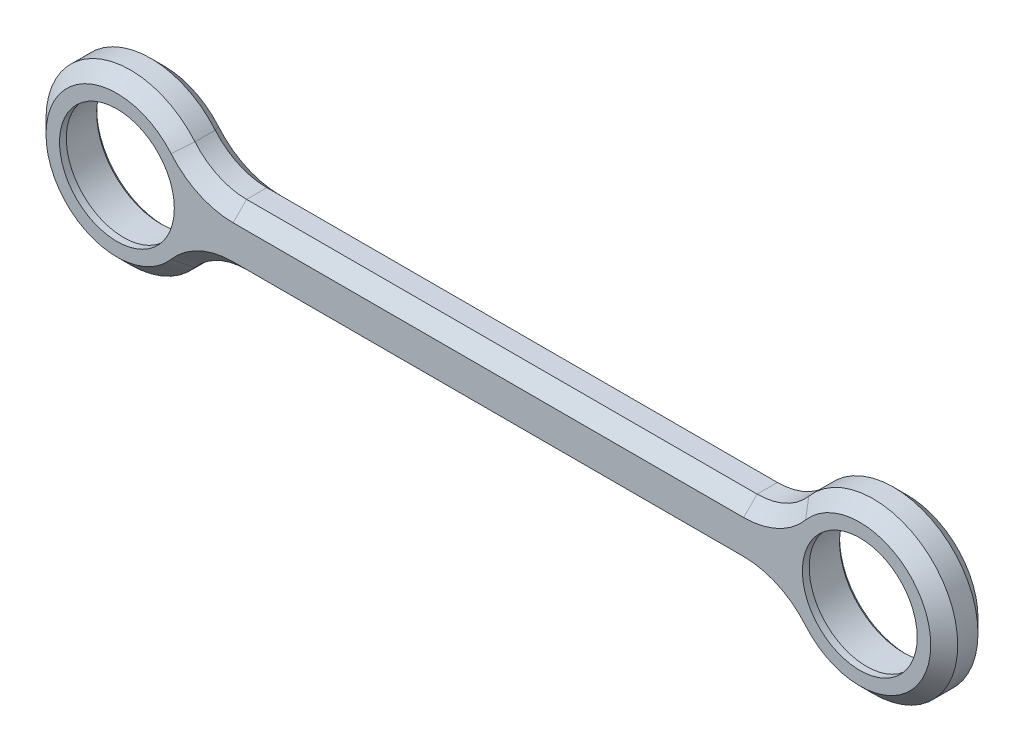
ISO-10303-21;
HEADER;
FILE_DESCRIPTION(('STEP AP214'),'2;1');
FILE_NAME('part.step','',(''),(''),'','','');
FILE_SCHEMA(('AUTOMOTIVE_DESIGN { 1 0 10303 214 1 1 1 1 }'));
ENDSEC;
DATA;
#1=APPLICATION_CONTEXT('core data for automotive mechanical design processes');
#2=APPLICATION_PROTOCOL_DEFINITION('international standard','automotive_design',2000,#1);
#3=PRODUCT_CONTEXT('',#1,'mechanical');
#4=PRODUCT('Part','Part','',(#3));
#5=PRODUCT_RELATED_PRODUCT_CATEGORY('part','',(#4));
#6=PRODUCT_DEFINITION_FORMATION('','',#4);
#7=PRODUCT_DEFINITION_CONTEXT('part definition',#1,'design');
#8=PRODUCT_DEFINITION('design','',#6,#7);
#9=PRODUCT_DEFINITION_SHAPE('','',#8);
#10=(LENGTH_UNIT() NAMED_UNIT(*) SI_UNIT(.MILLI.,.METRE.));
#11=(NAMED_UNIT(*) PLANE_ANGLE_UNIT() SI_UNIT($,.RADIAN.));
#12=(NAMED_UNIT(*) SI_UNIT($,.STERADIAN.) SOLID_ANGLE_UNIT());
#13=UNCERTAINTY_MEASURE_WITH_UNIT(LENGTH_MEASURE(1.E-05),#10,'distance_accuracy_value','');
#14=(GEOMETRIC_REPRESENTATION_CONTEXT(3) GLOBAL_UNCERTAINTY_ASSIGNED_CONTEXT((#13)) GLOBAL_UNIT_ASSIGNED_CONTEXT((#10,
#11,#12)) REPRESENTATION_CONTEXT('',''));
#15=CARTESIAN_POINT('',(0.,0.,0.));
#16=DIRECTION('',(0.,0.,1.));
#17=DIRECTION('',(1.,0.,0.));
#18=AXIS2_PLACEMENT_3D('',#15,#16,#17);
#19=CARTESIAN_POINT('',(9.19809234408251,-24.5,-145.795302177454));
#20=DIRECTION('',(0.,1.,0.));
#21=DIRECTION('',(0.,0.,1.));
#22=AXIS2_PLACEMENT_3D('',#19,#20,#21);
#23=PLANE('',#22);
#24=DIRECTION('',(0.,0.,-1.));
#25=VECTOR('',#24,1.);
#26=CARTESIAN_POINT('',(-92.795349465914,-24.5,-8.49999999999557));
#27=LINE('',#26,#25);
#28=CARTESIAN_POINT('',(-92.795349465914,-24.5,-3.49999999999559));
#29=VERTEX_POINT('',#28);
#30=CARTESIAN_POINT('',(-92.795349465914,-24.5,-6.49999999999554));
#31=VERTEX_POINT('',#30);
#32=EDGE_CURVE('E191',#29,#31,#27,.T.);
#33=ORIENTED_EDGE('',*,*,#32,.T.);
#34=DIRECTION('',(1.,0.,0.));
#35=VECTOR('',#34,1.);
#36=CARTESIAN_POINT('',(9.19809234408251,-24.5,-6.49999999999554));
#37=LINE('',#36,#35);
#38=CARTESIAN_POINT('',(-17.2046505340859,-24.5,-6.49999999999554));
#39=VERTEX_POINT('',#38);
#40=EDGE_CURVE('E163',#31,#39,#37,.T.);
#41=ORIENTED_EDGE('',*,*,#40,.T.);
#42=DIRECTION('',(0.,0.,-1.));
#43=VECTOR('',#42,1.);
#44=CARTESIAN_POINT('',(-17.2046505340859,-24.5,-1.49999999999556));
#45=LINE('',#44,#43);
#46=CARTESIAN_POINT('',(-17.2046505340859,-24.5,-3.49999999999559));
#47=VERTEX_POINT('',#46);
#48=EDGE_CURVE('E189',#39,#47,#45,.F.);
#49=ORIENTED_EDGE('',*,*,#48,.T.);
#50=DIRECTION('',(-1.,0.,0.));
#51=VECTOR('',#50,1.);
#52=CARTESIAN_POINT('',(-92.795349465914,-24.5,-3.49999999999559));
#53=LINE('',#52,#51);
#54=EDGE_CURVE('E195',#47,#29,#53,.T.);
#55=ORIENTED_EDGE('',*,*,#54,.T.);
#56=EDGE_LOOP('',(#33,#41,#49,#55));
#57=FACE_BOUND('',#56,.T.);
#58=ADVANCED_FACE('F40',(#57),#23,.F.);
#59=CARTESIAN_POINT('',(-109.999999999999,-20.,-145.795302177454));
#60=DIRECTION('',(0.,0.,1.));
#61=DIRECTION('',(1.,0.,0.));
#62=AXIS2_PLACEMENT_3D('',#59,#60,#61);
#63=CYLINDRICAL_SURFACE('',#62,12.5);
#64=DIRECTION('',(0.,0.,1.));
#65=VECTOR('',#64,1.);
#66=CARTESIAN_POINT('',(-100.441860814396,-11.9444444444444,-145.795302177454));
#67=LINE('',#66,#65);
#68=CARTESIAN_POINT('',(-100.441860814396,-11.9444444444444,-3.49999999999559));
#69=VERTEX_POINT('',#68);
#70=CARTESIAN_POINT('',(-100.441860814396,-11.9444444444444,-6.49999999999554));
#71=VERTEX_POINT('',#70);
#72=EDGE_CURVE('E200',#69,#71,#67,.F.);
#73=ORIENTED_EDGE('',*,*,#72,.T.);
#74=CARTESIAN_POINT('',(-109.999999999999,-20.,-6.49999999999554));
#75=DIRECTION('',(0.,0.,1.));
#76=DIRECTION('',(1.,0.,0.));
#77=AXIS2_PLACEMENT_3D('',#74,#75,#76);
#78=CIRCLE('',#77,12.5);
#79=CARTESIAN_POINT('',(-100.441860814396,-28.0555555555556,-6.49999999999554));
#80=VERTEX_POINT('',#79);
#81=EDGE_CURVE('E255',#71,#80,#78,.T.);
#82=ORIENTED_EDGE('',*,*,#81,.T.);
#83=DIRECTION('',(0.,0.,1.));
#84=VECTOR('',#83,1.);
#85=CARTESIAN_POINT('',(-100.441860814396,-28.0555555555556,-145.795302177454));
#86=LINE('',#85,#84);
#87=CARTESIAN_POINT('',(-100.441860814396,-28.0555555555556,-3.49999999999559));
#88=VERTEX_POINT('',#87);
#89=EDGE_CURVE('E206',#80,#88,#86,.T.);
#90=ORIENTED_EDGE('',*,*,#89,.T.);
#91=CARTESIAN_POINT('',(-109.999999999999,-20.,-3.49999999999559));
#92=DIRECTION('',(0.,0.,1.));
#93=DIRECTION('',(1.,0.,0.));
#94=AXIS2_PLACEMENT_3D('',#91,#92,#93);
#95=CIRCLE('',#94,12.5);
#96=EDGE_CURVE('E252',#88,#69,#95,.F.);
#97=ORIENTED_EDGE('',*,*,#96,.T.);
#98=EDGE_LOOP('',(#73,#82,#90,#97));
#99=FACE_BOUND('',#98,.T.);
#100=ADVANCED_FACE('F467',(#99),#63,.T.);
#101=CARTESIAN_POINT('',(9.19809234408251,-15.5,-145.795302177454));
#102=DIRECTION('',(0.,-1.,0.));
#103=DIRECTION('',(0.,0.,-1.));
#104=AXIS2_PLACEMENT_3D('',#101,#102,#103);
#105=PLANE('',#104);
#106=DIRECTION('',(0.,0.,-1.));
#107=VECTOR('',#106,1.);
#108=CARTESIAN_POINT('',(-17.2046505340859,-15.5,-8.49999999999557));
#109=LINE('',#108,#107);
#110=CARTESIAN_POINT('',(-17.2046505340859,-15.5,-3.49999999999559));
#111=VERTEX_POINT('',#110);
#112=CARTESIAN_POINT('',(-17.2046505340859,-15.5,-6.49999999999554));
#113=VERTEX_POINT('',#112);
#114=EDGE_CURVE('E209',#111,#113,#109,.T.);
#115=ORIENTED_EDGE('',*,*,#114,.T.);
#116=DIRECTION('',(-1.,0.,0.));
#117=VECTOR('',#116,1.);
#118=CARTESIAN_POINT('',(9.19809234408251,-15.5,-6.49999999999554));
#119=LINE('',#118,#117);
#120=CARTESIAN_POINT('',(-92.7953494659139,-15.5,-6.49999999999554));
#121=VERTEX_POINT('',#120);
#122=EDGE_CURVE('E273',#113,#121,#119,.T.);
#123=ORIENTED_EDGE('',*,*,#122,.T.);
#124=DIRECTION('',(0.,0.,-1.));
#125=VECTOR('',#124,1.);
#126=CARTESIAN_POINT('',(-92.7953494659139,-15.5,-1.49999999999556));
#127=LINE('',#126,#125);
#128=CARTESIAN_POINT('',(-92.7953494659139,-15.5,-3.49999999999559));
#129=VERTEX_POINT('',#128);
#130=EDGE_CURVE('E399',#121,#129,#127,.F.);
#131=ORIENTED_EDGE('',*,*,#130,.T.);
#132=DIRECTION('',(1.,0.,0.));
#133=VECTOR('',#132,1.);
#134=CARTESIAN_POINT('',(-17.2046505340859,-15.5,-3.49999999999559));
#135=LINE('',#134,#133);
#136=EDGE_CURVE('E270',#129,#111,#135,.T.);
#137=ORIENTED_EDGE('',*,*,#136,.T.);
#138=EDGE_LOOP('',(#115,#123,#131,#137));
#139=FACE_BOUND('',#138,.T.);
#140=ADVANCED_FACE('F413',(#139),#105,.F.);
#141=CARTESIAN_POINT('',(-6.09765588539139E-13,-20.,-145.795302177454));
#142=DIRECTION('',(0.,0.,1.));
#143=DIRECTION('',(1.,0.,0.));
#144=AXIS2_PLACEMENT_3D('',#141,#142,#143);
#145=CYLINDRICAL_SURFACE('',#144,12.5);
#146=DIRECTION('',(0.,0.,1.));
#147=VECTOR('',#146,1.);
#148=CARTESIAN_POINT('',(-9.55813918560353,-28.0555555555556,-145.795302177454));
#149=LINE('',#148,#147);
#150=CARTESIAN_POINT('',(-9.55813918560353,-28.0555555555556,-3.49999999999559));
#151=VERTEX_POINT('',#150);
#152=CARTESIAN_POINT('',(-9.55813918560353,-28.0555555555556,-6.49999999999554));
#153=VERTEX_POINT('',#152);
#154=EDGE_CURVE('E391',#151,#153,#149,.F.);
#155=ORIENTED_EDGE('',*,*,#154,.T.);
#156=CARTESIAN_POINT('',(-6.09765588539139E-13,-20.,-6.49999999999554));
#157=DIRECTION('',(0.,0.,1.));
#158=DIRECTION('',(1.,0.,0.));
#159=AXIS2_PLACEMENT_3D('',#156,#157,#158);
#160=CIRCLE('',#159,12.5);
#161=CARTESIAN_POINT('',(-9.55813918560353,-11.9444444444445,-6.49999999999554));
#162=VERTEX_POINT('',#161);
#163=EDGE_CURVE('E249',#153,#162,#160,.T.);
#164=ORIENTED_EDGE('',*,*,#163,.T.);
#165=DIRECTION('',(0.,0.,1.));
#166=VECTOR('',#165,1.);
#167=CARTESIAN_POINT('',(-9.55813918560353,-11.9444444444445,-145.795302177454));
#168=LINE('',#167,#166);
#169=CARTESIAN_POINT('',(-9.55813918560353,-11.9444444444445,-3.49999999999559));
#170=VERTEX_POINT('',#169);
#171=EDGE_CURVE('E389',#162,#170,#168,.T.);
#172=ORIENTED_EDGE('',*,*,#171,.T.);
#173=CARTESIAN_POINT('',(-6.09765588539139E-13,-20.,-3.49999999999559));
#174=DIRECTION('',(0.,0.,1.));
#175=DIRECTION('',(1.,0.,0.));
#176=AXIS2_PLACEMENT_3D('',#173,#174,#175);
#177=CIRCLE('',#176,12.5);
#178=EDGE_CURVE('E246',#170,#151,#177,.F.);
#179=ORIENTED_EDGE('',*,*,#178,.T.);
#180=EDGE_LOOP('',(#155,#164,#172,#179));
#181=FACE_BOUND('',#180,.T.);
#182=ADVANCED_FACE('F388',(#181),#145,.T.);
#183=CARTESIAN_POINT('',(-6.09765588539139E-13,-20.,-145.795302177454));
#184=DIRECTION('',(0.,0.,1.));
#185=DIRECTION('',(1.,0.,0.));
#186=AXIS2_PLACEMENT_3D('',#183,#184,#185);
#187=CYLINDRICAL_SURFACE('',#186,9.49999999999999);
#188=CARTESIAN_POINT('',(-6.09765588539139E-13,-20.,-7.99999999999557));
#189=DIRECTION('',(0.,0.,1.));
#190=DIRECTION('',(1.,0.,0.));
#191=AXIS2_PLACEMENT_3D('',#188,#189,#190);
#192=CIRCLE('',#191,9.49999999999999);
#193=CARTESIAN_POINT('',(9.49999999999938,-20.,-7.99999999999557));
#194=VERTEX_POINT('',#193);
#195=EDGE_CURVE('E50',#194,#194,#192,.F.);
#196=ORIENTED_EDGE('',*,*,#195,.T.);
#197=EDGE_LOOP('',(#196));
#198=FACE_BOUND('',#197,.T.);
#199=CARTESIAN_POINT('',(-6.09765588539139E-13,-20.,-2.49999999999556));
#200=DIRECTION('',(0.,0.,-1.));
#201=DIRECTION('',(0.,1.,0.));
#202=AXIS2_PLACEMENT_3D('',#199,#200,#201);
#203=CIRCLE('',#202,9.49999999999999);
#204=CARTESIAN_POINT('',(-6.09765588539139E-13,-10.5,-2.49999999999555));
#205=VERTEX_POINT('',#204);
#206=EDGE_CURVE('E429',#205,#205,#203,.T.);
#207=ORIENTED_EDGE('',*,*,#206,.F.);
#208=EDGE_LOOP('',(#207));
#209=FACE_BOUND('',#208,.T.);
#210=ADVANCED_FACE('F362',(#198,#209),#187,.F.);
#211=CARTESIAN_POINT('',(-109.999999999999,-20.,-145.795302177454));
#212=DIRECTION('',(0.,0.,1.));
#213=DIRECTION('',(1.,0.,0.));
#214=AXIS2_PLACEMENT_3D('',#211,#212,#213);
#215=CYLINDRICAL_SURFACE('',#214,9.49999999999953);
#216=CARTESIAN_POINT('',(-109.999999999999,-20.,-7.99999999999557));
#217=DIRECTION('',(0.,0.,1.));
#218=DIRECTION('',(1.,0.,0.));
#219=AXIS2_PLACEMENT_3D('',#216,#217,#218);
#220=CIRCLE('',#219,9.49999999999953);
#221=CARTESIAN_POINT('',(-100.5,-20.,-7.99999999999557));
#222=VERTEX_POINT('',#221);
#223=EDGE_CURVE('E11',#222,#222,#220,.F.);
#224=ORIENTED_EDGE('',*,*,#223,.T.);
#225=EDGE_LOOP('',(#224));
#226=FACE_BOUND('',#225,.T.);
#227=CARTESIAN_POINT('',(-109.999999999999,-20.,-2.49999999999556));
#228=DIRECTION('',(0.,0.,-1.));
#229=DIRECTION('',(0.,1.,0.));
#230=AXIS2_PLACEMENT_3D('',#227,#228,#229);
#231=CIRCLE('',#230,9.49999999999953);
#232=CARTESIAN_POINT('',(-109.999999999999,-10.5000000000004,-2.49999999999555));
#233=VERTEX_POINT('',#232);
#234=EDGE_CURVE('E425',#233,#233,#231,.T.);
#235=ORIENTED_EDGE('',*,*,#234,.F.);
#236=EDGE_LOOP('',(#235));
#237=FACE_BOUND('',#236,.T.);
#238=ADVANCED_FACE('F375',(#226,#237),#215,.F.);
#239=CARTESIAN_POINT('',(7.35354814963609,-20.1497737122483,-8.49999999999555));
#240=DIRECTION('',(0.,0.,1.));
#241=DIRECTION('',(0.999792646095991,-0.0203633202689731,0.));
#242=AXIS2_PLACEMENT_3D('',#239,#240,#241);
#243=PLANE('',#242);
#244=CARTESIAN_POINT('',(-6.09765588539139E-13,-20.,-8.49999999999555));
#245=DIRECTION('',(0.,0.,1.));
#246=DIRECTION('',(0.,-1.,0.));
#247=AXIS2_PLACEMENT_3D('',#244,#245,#246);
#248=CIRCLE('',#247,9.99999999999997);
#249=CARTESIAN_POINT('',(-6.09765588539139E-13,-30.,-8.49999999999556));
#250=VERTEX_POINT('',#249);
#251=EDGE_CURVE('E355',#250,#250,#248,.T.);
#252=ORIENTED_EDGE('',*,*,#251,.T.);
#253=EDGE_LOOP('',(#252));
#254=FACE_BOUND('',#253,.T.);
#255=CARTESIAN_POINT('',(-109.999999999999,-20.,-8.49999999999555));
#256=DIRECTION('',(0.,0.,1.));
#257=DIRECTION('',(0.,-1.,0.));
#258=AXIS2_PLACEMENT_3D('',#255,#256,#257);
#259=CIRCLE('',#258,9.9999999999995);
#260=CARTESIAN_POINT('',(-109.999999999999,-29.9999999999995,-8.49999999999556));
#261=VERTEX_POINT('',#260);
#262=EDGE_CURVE('E297',#261,#261,#259,.T.);
#263=ORIENTED_EDGE('',*,*,#262,.T.);
#264=EDGE_LOOP('',(#263));
#265=FACE_BOUND('',#264,.T.);
#266=CARTESIAN_POINT('',(-17.2046505340859,-34.5,-8.49999999999556));
#267=DIRECTION('',(0.,0.,1.));
#268=DIRECTION('',(0.,-1.,0.));
#269=AXIS2_PLACEMENT_3D('',#266,#267,#268);
#270=CIRCLE('',#269,12.);
#271=CARTESIAN_POINT('',(-8.02883691590706,-26.7666666666667,-8.49999999999556));
#272=VERTEX_POINT('',#271);
#273=CARTESIAN_POINT('',(-17.2046505340859,-22.5,-8.49999999999555));
#274=VERTEX_POINT('',#273);
#275=EDGE_CURVE('E234',#272,#274,#270,.T.);
#276=ORIENTED_EDGE('',*,*,#275,.T.);
#277=DIRECTION('',(-1.,0.,0.));
#278=VECTOR('',#277,1.);
#279=CARTESIAN_POINT('',(7.35354814963609,-22.5,-8.49999999999555));
#280=LINE('',#279,#278);
#281=CARTESIAN_POINT('',(-92.795349465914,-22.5,-8.49999999999555));
#282=VERTEX_POINT('',#281);
#283=EDGE_CURVE('E165',#274,#282,#280,.T.);
#284=ORIENTED_EDGE('',*,*,#283,.T.);
#285=CARTESIAN_POINT('',(-92.795349465914,-34.5,-8.49999999999556));
#286=DIRECTION('',(0.,0.,1.));
#287=DIRECTION('',(0.,-1.,0.));
#288=AXIS2_PLACEMENT_3D('',#285,#286,#287);
#289=CIRCLE('',#288,12.);
#290=CARTESIAN_POINT('',(-101.971163084093,-26.7666666666667,-8.49999999999556));
#291=VERTEX_POINT('',#290);
#292=EDGE_CURVE('E232',#282,#291,#289,.T.);
#293=ORIENTED_EDGE('',*,*,#292,.T.);
#294=CARTESIAN_POINT('',(-109.999999999999,-20.,-8.49999999999555));
#295=DIRECTION('',(0.,0.,1.));
#296=DIRECTION('',(0.,-1.,0.));
#297=AXIS2_PLACEMENT_3D('',#294,#295,#296);
#298=CIRCLE('',#297,10.5);
#299=CARTESIAN_POINT('',(-101.971163084093,-13.2333333333333,-8.49999999999555));
#300=VERTEX_POINT('',#299);
#301=EDGE_CURVE('E226',#291,#300,#298,.F.);
#302=ORIENTED_EDGE('',*,*,#301,.T.);
#303=CARTESIAN_POINT('',(-92.7953494659139,-5.50000000000002,-8.49999999999555));
#304=DIRECTION('',(0.,0.,1.));
#305=DIRECTION('',(0.,-1.,0.));
#306=AXIS2_PLACEMENT_3D('',#303,#304,#305);
#307=CIRCLE('',#306,12.);
#308=CARTESIAN_POINT('',(-92.7953494659139,-17.5,-8.49999999999555));
#309=VERTEX_POINT('',#308);
#310=EDGE_CURVE('E220',#300,#309,#307,.T.);
#311=ORIENTED_EDGE('',*,*,#310,.T.);
#312=DIRECTION('',(1.,0.,0.));
#313=VECTOR('',#312,1.);
#314=CARTESIAN_POINT('',(7.35354814963609,-17.5,-8.49999999999555));
#315=LINE('',#314,#313);
#316=CARTESIAN_POINT('',(-17.2046505340859,-17.5,-8.49999999999555));
#317=VERTEX_POINT('',#316);
#318=EDGE_CURVE('E194',#309,#317,#315,.T.);
#319=ORIENTED_EDGE('',*,*,#318,.T.);
#320=CARTESIAN_POINT('',(-17.2046505340859,-5.50000000000002,-8.49999999999555));
#321=DIRECTION('',(0.,0.,1.));
#322=DIRECTION('',(0.,-1.,0.));
#323=AXIS2_PLACEMENT_3D('',#320,#321,#322);
#324=CIRCLE('',#323,12.);
#325=CARTESIAN_POINT('',(-8.02883691590706,-13.2333333333334,-8.49999999999555));
#326=VERTEX_POINT('',#325);
#327=EDGE_CURVE('E223',#317,#326,#324,.T.);
#328=ORIENTED_EDGE('',*,*,#327,.T.);
#329=CARTESIAN_POINT('',(-6.09765588539139E-13,-20.,-8.49999999999555));
#330=DIRECTION('',(0.,0.,1.));
#331=DIRECTION('',(0.,-1.,0.));
#332=AXIS2_PLACEMENT_3D('',#329,#330,#331);
#333=CIRCLE('',#332,10.5);
#334=EDGE_CURVE('E229',#326,#272,#333,.F.);
#335=ORIENTED_EDGE('',*,*,#334,.T.);
#336=EDGE_LOOP('',(#276,#284,#293,#302,#311,#319,#328,#335));
#337=FACE_BOUND('',#336,.T.);
#338=ADVANCED_FACE('F371',(#254,#265,#337),#243,.F.);
#339=CARTESIAN_POINT('',(-109.999999999999,-20.,-2.49999999999555));
#340=DIRECTION('',(0.,0.,1.));
#341=DIRECTION('',(1.,0.,0.));
#342=AXIS2_PLACEMENT_3D('',#339,#340,#341);
#343=PLANE('',#342);
#344=CARTESIAN_POINT('',(-6.09765588539139E-13,-20.,-2.49999999999555));
#345=DIRECTION('',(0.,0.,1.));
#346=DIRECTION('',(1.,0.,0.));
#347=AXIS2_PLACEMENT_3D('',#344,#345,#346);
#348=CIRCLE('',#347,8.5);
#349=CARTESIAN_POINT('',(8.49999999999939,-20.,-2.49999999999555));
#350=VERTEX_POINT('',#349);
#351=EDGE_CURVE('E323',#350,#350,#348,.T.);
#352=ORIENTED_EDGE('',*,*,#351,.T.);
#353=EDGE_LOOP('',(#352));
#354=FACE_BOUND('',#353,.T.);
#355=ORIENTED_EDGE('',*,*,#206,.T.);
#356=EDGE_LOOP('',(#355));
#357=FACE_BOUND('',#356,.T.);
#358=ADVANCED_FACE('F374',(#354,#357),#343,.F.);
#359=CARTESIAN_POINT('',(-109.999999999999,-20.,-2.49999999999555));
#360=DIRECTION('',(0.,0.,1.));
#361=DIRECTION('',(1.,0.,0.));
#362=AXIS2_PLACEMENT_3D('',#359,#360,#361);
#363=CIRCLE('',#362,8.50000000000001);
#364=CARTESIAN_POINT('',(-101.499999999999,-20.,-2.49999999999555));
#365=VERTEX_POINT('',#364);
#366=EDGE_CURVE('E434',#365,#365,#363,.T.);
#367=ORIENTED_EDGE('',*,*,#366,.T.);
#368=EDGE_LOOP('',(#367));
#369=FACE_BOUND('',#368,.T.);
#370=ORIENTED_EDGE('',*,*,#234,.T.);
#371=EDGE_LOOP('',(#370));
#372=FACE_BOUND('',#371,.T.);
#373=ADVANCED_FACE('F455',(#369,#372),#343,.F.);
#374=CARTESIAN_POINT('',(-109.999999999999,-20.,-1.49999999999555));
#375=DIRECTION('',(0.,0.,1.));
#376=DIRECTION('',(1.,0.,0.));
#377=AXIS2_PLACEMENT_3D('',#374,#375,#376);
#378=PLANE('',#377);
#379=CARTESIAN_POINT('',(-92.795349465914,-34.5,-1.49999999999555));
#380=DIRECTION('',(0.,0.,1.));
#381=DIRECTION('',(1.,0.,0.));
#382=AXIS2_PLACEMENT_3D('',#379,#380,#381);
#383=CIRCLE('',#382,12.);
#384=CARTESIAN_POINT('',(-101.971163084093,-26.7666666666666,-1.49999999999555));
#385=VERTEX_POINT('',#384);
#386=CARTESIAN_POINT('',(-92.795349465914,-22.5,-1.49999999999555));
#387=VERTEX_POINT('',#386);
#388=EDGE_CURVE('E65',#385,#387,#383,.F.);
#389=ORIENTED_EDGE('',*,*,#388,.T.);
#390=DIRECTION('',(1.,0.,0.));
#391=VECTOR('',#390,1.);
#392=CARTESIAN_POINT('',(-17.2046505340859,-22.5,-1.49999999999555));
#393=LINE('',#392,#391);
#394=CARTESIAN_POINT('',(-17.2046505340859,-22.5,-1.49999999999555));
#395=VERTEX_POINT('',#394);
#396=EDGE_CURVE('E295',#387,#395,#393,.T.);
#397=ORIENTED_EDGE('',*,*,#396,.T.);
#398=CARTESIAN_POINT('',(-17.2046505340859,-34.5,-1.49999999999555));
#399=DIRECTION('',(0.,0.,1.));
#400=DIRECTION('',(1.,0.,0.));
#401=AXIS2_PLACEMENT_3D('',#398,#399,#400);
#402=CIRCLE('',#401,12.);
#403=CARTESIAN_POINT('',(-8.02883691590703,-26.7666666666667,-1.49999999999555));
#404=VERTEX_POINT('',#403);
#405=EDGE_CURVE('E292',#395,#404,#402,.F.);
#406=ORIENTED_EDGE('',*,*,#405,.T.);
#407=CARTESIAN_POINT('',(-6.09765588539139E-13,-20.,-1.49999999999555));
#408=DIRECTION('',(0.,0.,1.));
#409=DIRECTION('',(1.,0.,0.));
#410=AXIS2_PLACEMENT_3D('',#407,#408,#409);
#411=CIRCLE('',#410,10.5);
#412=CARTESIAN_POINT('',(-8.02883691590703,-13.2333333333334,-1.49999999999555));
#413=VERTEX_POINT('',#412);
#414=EDGE_CURVE('E287',#404,#413,#411,.T.);
#415=ORIENTED_EDGE('',*,*,#414,.T.);
#416=CARTESIAN_POINT('',(-17.2046505340859,-5.50000000000002,-1.49999999999555));
#417=DIRECTION('',(0.,0.,1.));
#418=DIRECTION('',(1.,0.,0.));
#419=AXIS2_PLACEMENT_3D('',#416,#417,#418);
#420=CIRCLE('',#419,12.);
#421=CARTESIAN_POINT('',(-17.2046505340859,-17.5,-1.49999999999555));
#422=VERTEX_POINT('',#421);
#423=EDGE_CURVE('E282',#413,#422,#420,.F.);
#424=ORIENTED_EDGE('',*,*,#423,.T.);
#425=DIRECTION('',(-1.,0.,0.));
#426=VECTOR('',#425,1.);
#427=CARTESIAN_POINT('',(-92.7953494659139,-17.5,-1.49999999999555));
#428=LINE('',#427,#426);
#429=CARTESIAN_POINT('',(-92.7953494659139,-17.5,-1.49999999999555));
#430=VERTEX_POINT('',#429);
#431=EDGE_CURVE('E276',#422,#430,#428,.T.);
#432=ORIENTED_EDGE('',*,*,#431,.T.);
#433=CARTESIAN_POINT('',(-92.7953494659139,-5.50000000000002,-1.49999999999555));
#434=DIRECTION('',(0.,0.,1.));
#435=DIRECTION('',(1.,0.,0.));
#436=AXIS2_PLACEMENT_3D('',#433,#434,#435);
#437=CIRCLE('',#436,12.);
#438=CARTESIAN_POINT('',(-101.971163084093,-13.2333333333333,-1.49999999999555));
#439=VERTEX_POINT('',#438);
#440=EDGE_CURVE('E279',#430,#439,#437,.F.);
#441=ORIENTED_EDGE('',*,*,#440,.T.);
#442=CARTESIAN_POINT('',(-109.999999999999,-20.,-1.49999999999555));
#443=DIRECTION('',(0.,0.,1.));
#444=DIRECTION('',(1.,0.,0.));
#445=AXIS2_PLACEMENT_3D('',#442,#443,#444);
#446=CIRCLE('',#445,10.5);
#447=EDGE_CURVE('E284',#439,#385,#446,.T.);
#448=ORIENTED_EDGE('',*,*,#447,.T.);
#449=EDGE_LOOP('',(#389,#397,#406,#415,#424,#432,#441,#448));
#450=FACE_BOUND('',#449,.T.);
#451=CARTESIAN_POINT('',(-109.999999999999,-20.,-1.49999999999555));
#452=DIRECTION('',(0.,0.,1.));
#453=DIRECTION('',(1.,0.,0.));
#454=AXIS2_PLACEMENT_3D('',#451,#452,#453);
#455=CIRCLE('',#454,8.50000000000001);
#456=CARTESIAN_POINT('',(-101.499999999999,-20.,-1.49999999999555));
#457=VERTEX_POINT('',#456);
#458=EDGE_CURVE('E433',#457,#457,#455,.T.);
#459=ORIENTED_EDGE('',*,*,#458,.F.);
#460=EDGE_LOOP('',(#459));
#461=FACE_BOUND('',#460,.T.);
#462=CARTESIAN_POINT('',(-6.09765588539139E-13,-20.,-1.49999999999555));
#463=DIRECTION('',(0.,0.,1.));
#464=DIRECTION('',(1.,0.,0.));
#465=AXIS2_PLACEMENT_3D('',#462,#463,#464);
#466=CIRCLE('',#465,8.5);
#467=CARTESIAN_POINT('',(8.49999999999939,-20.,-1.49999999999555));
#468=VERTEX_POINT('',#467);
#469=EDGE_CURVE('E438',#468,#468,#466,.T.);
#470=ORIENTED_EDGE('',*,*,#469,.F.);
#471=EDGE_LOOP('',(#470));
#472=FACE_BOUND('',#471,.T.);
#473=ADVANCED_FACE('F452',(#450,#461,#472),#378,.T.);
#474=CARTESIAN_POINT('',(-109.999999999999,-20.,-1.49999999999555));
#475=DIRECTION('',(0.,0.,-1.));
#476=DIRECTION('',(-1.,0.,0.));
#477=AXIS2_PLACEMENT_3D('',#474,#475,#476);
#478=CYLINDRICAL_SURFACE('',#477,8.50000000000001);
#479=ORIENTED_EDGE('',*,*,#458,.T.);
#480=EDGE_LOOP('',(#479));
#481=FACE_BOUND('',#480,.T.);
#482=ORIENTED_EDGE('',*,*,#366,.F.);
#483=EDGE_LOOP('',(#482));
#484=FACE_BOUND('',#483,.T.);
#485=ADVANCED_FACE('F454',(#481,#484),#478,.F.);
#486=CARTESIAN_POINT('',(-6.09765588539139E-13,-20.,-1.49999999999555));
#487=DIRECTION('',(0.,0.,-1.));
#488=DIRECTION('',(-1.,0.,0.));
#489=AXIS2_PLACEMENT_3D('',#486,#487,#488);
#490=CYLINDRICAL_SURFACE('',#489,8.5);
#491=ORIENTED_EDGE('',*,*,#469,.T.);
#492=EDGE_LOOP('',(#491));
#493=FACE_BOUND('',#492,.T.);
#494=ORIENTED_EDGE('',*,*,#351,.F.);
#495=EDGE_LOOP('',(#494));
#496=FACE_BOUND('',#495,.T.);
#497=ADVANCED_FACE('F449',(#493,#496),#490,.F.);
#498=CARTESIAN_POINT('',(-17.2046505340859,-5.50000000000002,-145.795302177454));
#499=DIRECTION('',(0.,0.,1.));
#500=DIRECTION('',(1.,0.,0.));
#501=AXIS2_PLACEMENT_3D('',#498,#499,#500);
#502=CYLINDRICAL_SURFACE('',#501,10.);
#503=ORIENTED_EDGE('',*,*,#171,.F.);
#504=CARTESIAN_POINT('',(-17.2046505340859,-5.50000000000002,-6.49999999999554));
#505=DIRECTION('',(0.,0.,1.));
#506=DIRECTION('',(1.,0.,0.));
#507=AXIS2_PLACEMENT_3D('',#504,#505,#506);
#508=CIRCLE('',#507,10.);
#509=EDGE_CURVE('E261',#162,#113,#508,.F.);
#510=ORIENTED_EDGE('',*,*,#509,.T.);
#511=ORIENTED_EDGE('',*,*,#114,.F.);
#512=CARTESIAN_POINT('',(-17.2046505340859,-5.50000000000002,-3.49999999999559));
#513=DIRECTION('',(0.,0.,1.));
#514=DIRECTION('',(1.,0.,0.));
#515=AXIS2_PLACEMENT_3D('',#512,#513,#514);
#516=CIRCLE('',#515,10.);
#517=EDGE_CURVE('E258',#111,#170,#516,.T.);
#518=ORIENTED_EDGE('',*,*,#517,.T.);
#519=EDGE_LOOP('',(#503,#510,#511,#518));
#520=FACE_BOUND('',#519,.T.);
#521=ADVANCED_FACE('F394',(#520),#502,.F.);
#522=CARTESIAN_POINT('',(-17.2046505340859,-34.5,-145.795302177454));
#523=DIRECTION('',(0.,0.,1.));
#524=DIRECTION('',(1.,0.,0.));
#525=AXIS2_PLACEMENT_3D('',#522,#523,#524);
#526=CYLINDRICAL_SURFACE('',#525,10.);
#527=ORIENTED_EDGE('',*,*,#48,.F.);
#528=CARTESIAN_POINT('',(-17.2046505340859,-34.5,-6.49999999999554));
#529=DIRECTION('',(0.,0.,1.));
#530=DIRECTION('',(1.,0.,0.));
#531=AXIS2_PLACEMENT_3D('',#528,#529,#530);
#532=CIRCLE('',#531,10.);
#533=EDGE_CURVE('E173',#39,#153,#532,.F.);
#534=ORIENTED_EDGE('',*,*,#533,.T.);
#535=ORIENTED_EDGE('',*,*,#154,.F.);
#536=CARTESIAN_POINT('',(-17.2046505340859,-34.5,-3.49999999999559));
#537=DIRECTION('',(0.,0.,1.));
#538=DIRECTION('',(1.,0.,0.));
#539=AXIS2_PLACEMENT_3D('',#536,#537,#538);
#540=CIRCLE('',#539,10.);
#541=EDGE_CURVE('E183',#151,#47,#540,.T.);
#542=ORIENTED_EDGE('',*,*,#541,.T.);
#543=EDGE_LOOP('',(#527,#534,#535,#542));
#544=FACE_BOUND('',#543,.T.);
#545=ADVANCED_FACE('F197',(#544),#526,.F.);
#546=CARTESIAN_POINT('',(-92.795349465914,-34.5,-145.795302177454));
#547=DIRECTION('',(0.,0.,1.));
#548=DIRECTION('',(1.,0.,0.));
#549=AXIS2_PLACEMENT_3D('',#546,#547,#548);
#550=CYLINDRICAL_SURFACE('',#549,10.);
#551=ORIENTED_EDGE('',*,*,#89,.F.);
#552=CARTESIAN_POINT('',(-92.795349465914,-34.5,-6.49999999999554));
#553=DIRECTION('',(0.,0.,1.));
#554=DIRECTION('',(1.,0.,0.));
#555=AXIS2_PLACEMENT_3D('',#552,#553,#554);
#556=CIRCLE('',#555,10.);
#557=EDGE_CURVE('E243',#80,#31,#556,.F.);
#558=ORIENTED_EDGE('',*,*,#557,.T.);
#559=ORIENTED_EDGE('',*,*,#32,.F.);
#560=CARTESIAN_POINT('',(-92.795349465914,-34.5,-3.49999999999559));
#561=DIRECTION('',(0.,0.,1.));
#562=DIRECTION('',(1.,0.,0.));
#563=AXIS2_PLACEMENT_3D('',#560,#561,#562);
#564=CIRCLE('',#563,10.);
#565=EDGE_CURVE('E182',#29,#88,#564,.T.);
#566=ORIENTED_EDGE('',*,*,#565,.T.);
#567=EDGE_LOOP('',(#551,#558,#559,#566));
#568=FACE_BOUND('',#567,.T.);
#569=ADVANCED_FACE('F485',(#568),#550,.F.);
#570=CARTESIAN_POINT('',(-92.7953494659139,-5.50000000000002,-145.795302177454));
#571=DIRECTION('',(0.,0.,1.));
#572=DIRECTION('',(1.,0.,0.));
#573=AXIS2_PLACEMENT_3D('',#570,#571,#572);
#574=CYLINDRICAL_SURFACE('',#573,10.);
#575=ORIENTED_EDGE('',*,*,#130,.F.);
#576=CARTESIAN_POINT('',(-92.7953494659139,-5.50000000000002,-6.49999999999554));
#577=DIRECTION('',(0.,0.,1.));
#578=DIRECTION('',(1.,0.,0.));
#579=AXIS2_PLACEMENT_3D('',#576,#577,#578);
#580=CIRCLE('',#579,10.);
#581=EDGE_CURVE('E267',#121,#71,#580,.F.);
#582=ORIENTED_EDGE('',*,*,#581,.T.);
#583=ORIENTED_EDGE('',*,*,#72,.F.);
#584=CARTESIAN_POINT('',(-92.7953494659139,-5.50000000000002,-3.49999999999559));
#585=DIRECTION('',(0.,0.,1.));
#586=DIRECTION('',(1.,0.,0.));
#587=AXIS2_PLACEMENT_3D('',#584,#585,#586);
#588=CIRCLE('',#587,10.);
#589=EDGE_CURVE('E264',#69,#129,#588,.T.);
#590=ORIENTED_EDGE('',*,*,#589,.T.);
#591=EDGE_LOOP('',(#575,#582,#583,#590));
#592=FACE_BOUND('',#591,.T.);
#593=ADVANCED_FACE('F416',(#592),#574,.F.);
#594=CARTESIAN_POINT('',(9.19809234408251,-15.5,-6.49999999999554));
#595=DIRECTION('',(0.,-0.707106781186548,0.707106781186547));
#596=DIRECTION('',(-1.,0.,0.));
#597=AXIS2_PLACEMENT_3D('',#594,#595,#596);
#598=PLANE('',#597);
#599=DIRECTION('',(0.,0.707106781186547,0.707106781186548));
#600=VECTOR('',#599,1.);
#601=CARTESIAN_POINT('',(-17.2046505340859,-17.5,-8.49999999999555));
#602=LINE('',#601,#600);
#603=EDGE_CURVE('E315',#317,#113,#602,.T.);
#604=ORIENTED_EDGE('',*,*,#603,.F.);
#605=ORIENTED_EDGE('',*,*,#318,.F.);
#606=DIRECTION('',(0.,-0.707106781186547,-0.707106781186548));
#607=VECTOR('',#606,1.);
#608=CARTESIAN_POINT('',(-92.7953494659139,-15.5,-6.49999999999554));
#609=LINE('',#608,#607);
#610=EDGE_CURVE('E319',#121,#309,#609,.T.);
#611=ORIENTED_EDGE('',*,*,#610,.F.);
#612=ORIENTED_EDGE('',*,*,#122,.F.);
#613=EDGE_LOOP('',(#604,#605,#611,#612));
#614=FACE_BOUND('',#613,.T.);
#615=ADVANCED_FACE('F407',(#614),#598,.F.);
#616=CARTESIAN_POINT('',(-92.7953494659139,-5.50000000000002,-8.49999999999557));
#617=DIRECTION('',(0.,0.,-1.));
#618=DIRECTION('',(-1.,0.,0.));
#619=AXIS2_PLACEMENT_3D('',#616,#617,#618);
#620=CONICAL_SURFACE('',#619,12.,0.785398163397445);
#621=ORIENTED_EDGE('',*,*,#610,.T.);
#622=ORIENTED_EDGE('',*,*,#310,.F.);
#623=DIRECTION('',(-0.540690002693174,-0.455691036764661,-0.70710678118655));
#624=VECTOR('',#623,1.);
#625=CARTESIAN_POINT('',(-100.441860814396,-11.9444444444444,-6.49999999999554));
#626=LINE('',#625,#624);
#627=EDGE_CURVE('E311',#71,#300,#626,.T.);
#628=ORIENTED_EDGE('',*,*,#627,.F.);
#629=ORIENTED_EDGE('',*,*,#581,.F.);
#630=EDGE_LOOP('',(#621,#622,#628,#629));
#631=FACE_BOUND('',#630,.T.);
#632=ADVANCED_FACE('F528',(#631),#620,.F.);
#633=CARTESIAN_POINT('',(-17.2046505340859,-5.50000000000002,-8.49999999999557));
#634=DIRECTION('',(0.,0.,-1.));
#635=DIRECTION('',(-1.,0.,0.));
#636=AXIS2_PLACEMENT_3D('',#633,#634,#635);
#637=CONICAL_SURFACE('',#636,12.,0.785398163397445);
#638=ORIENTED_EDGE('',*,*,#603,.T.);
#639=ORIENTED_EDGE('',*,*,#509,.F.);
#640=DIRECTION('',(-0.540690002693173,0.455691036764662,0.70710678118655));
#641=VECTOR('',#640,1.);
#642=CARTESIAN_POINT('',(-8.02883691590706,-13.2333333333334,-8.49999999999555));
#643=LINE('',#642,#641);
#644=EDGE_CURVE('E307',#326,#162,#643,.T.);
#645=ORIENTED_EDGE('',*,*,#644,.F.);
#646=ORIENTED_EDGE('',*,*,#327,.F.);
#647=EDGE_LOOP('',(#638,#639,#645,#646));
#648=FACE_BOUND('',#647,.T.);
#649=ADVANCED_FACE('F402',(#648),#637,.F.);
#650=CARTESIAN_POINT('',(-109.999999999999,-20.,-6.49999999999554));
#651=DIRECTION('',(0.,0.,1.));
#652=DIRECTION('',(1.,0.,0.));
#653=AXIS2_PLACEMENT_3D('',#650,#651,#652);
#654=CONICAL_SURFACE('',#653,12.5,0.785398163397445);
#655=ORIENTED_EDGE('',*,*,#627,.T.);
#656=ORIENTED_EDGE('',*,*,#301,.F.);
#657=DIRECTION('',(-0.540690002693169,0.455691036764665,-0.707106781186551));
#658=VECTOR('',#657,1.);
#659=CARTESIAN_POINT('',(-100.441860814396,-28.0555555555556,-6.49999999999554));
#660=LINE('',#659,#658);
#661=EDGE_CURVE('E303',#80,#291,#660,.T.);
#662=ORIENTED_EDGE('',*,*,#661,.F.);
#663=ORIENTED_EDGE('',*,*,#81,.F.);
#664=EDGE_LOOP('',(#655,#656,#662,#663));
#665=FACE_BOUND('',#664,.T.);
#666=ADVANCED_FACE('F516',(#665),#654,.T.);
#667=CARTESIAN_POINT('',(-6.09765588539139E-13,-20.,-6.49999999999554));
#668=DIRECTION('',(0.,0.,1.));
#669=DIRECTION('',(1.,0.,0.));
#670=AXIS2_PLACEMENT_3D('',#667,#668,#669);
#671=CONICAL_SURFACE('',#670,12.5,0.785398163397445);
#672=ORIENTED_EDGE('',*,*,#644,.T.);
#673=ORIENTED_EDGE('',*,*,#163,.F.);
#674=DIRECTION('',(-0.540690002693173,-0.455691036764662,0.70710678118655));
#675=VECTOR('',#674,1.);
#676=CARTESIAN_POINT('',(-8.02883691590706,-26.7666666666667,-8.49999999999556));
#677=LINE('',#676,#675);
#678=EDGE_CURVE('E176',#272,#153,#677,.T.);
#679=ORIENTED_EDGE('',*,*,#678,.F.);
#680=ORIENTED_EDGE('',*,*,#334,.F.);
#681=EDGE_LOOP('',(#672,#673,#679,#680));
#682=FACE_BOUND('',#681,.T.);
#683=ADVANCED_FACE('F384',(#682),#671,.T.);
#684=CARTESIAN_POINT('',(-92.795349465914,-34.5,-8.49999999999557));
#685=DIRECTION('',(0.,0.,-1.));
#686=DIRECTION('',(-1.,0.,0.));
#687=AXIS2_PLACEMENT_3D('',#684,#685,#686);
#688=CONICAL_SURFACE('',#687,12.,0.785398163397445);
#689=ORIENTED_EDGE('',*,*,#661,.T.);
#690=ORIENTED_EDGE('',*,*,#292,.F.);
#691=DIRECTION('',(0.,0.707106781186546,-0.707106781186549));
#692=VECTOR('',#691,1.);
#693=CARTESIAN_POINT('',(-92.795349465914,-24.5,-6.49999999999554));
#694=LINE('',#693,#692);
#695=EDGE_CURVE('E169',#31,#282,#694,.T.);
#696=ORIENTED_EDGE('',*,*,#695,.F.);
#697=ORIENTED_EDGE('',*,*,#557,.F.);
#698=EDGE_LOOP('',(#689,#690,#696,#697));
#699=FACE_BOUND('',#698,.T.);
#700=ADVANCED_FACE('F504',(#699),#688,.F.);
#701=CARTESIAN_POINT('',(-17.2046505340859,-34.5,-8.49999999999557));
#702=DIRECTION('',(0.,0.,-1.));
#703=DIRECTION('',(-1.,0.,0.));
#704=AXIS2_PLACEMENT_3D('',#701,#702,#703);
#705=CONICAL_SURFACE('',#704,12.,0.785398163397445);
#706=ORIENTED_EDGE('',*,*,#678,.T.);
#707=ORIENTED_EDGE('',*,*,#533,.F.);
#708=DIRECTION('',(0.,-0.707106781186545,0.70710678118655));
#709=VECTOR('',#708,1.);
#710=CARTESIAN_POINT('',(-17.2046505340859,-22.5,-8.49999999999555));
#711=LINE('',#710,#709);
#712=EDGE_CURVE('E159',#274,#39,#711,.T.);
#713=ORIENTED_EDGE('',*,*,#712,.F.);
#714=ORIENTED_EDGE('',*,*,#275,.F.);
#715=EDGE_LOOP('',(#706,#707,#713,#714));
#716=FACE_BOUND('',#715,.T.);
#717=ADVANCED_FACE('F174',(#716),#705,.F.);
#718=CARTESIAN_POINT('',(9.19809234408251,-24.5,-6.49999999999554));
#719=DIRECTION('',(0.,0.707106781186548,0.707106781186547));
#720=DIRECTION('',(1.,0.,0.));
#721=AXIS2_PLACEMENT_3D('',#718,#719,#720);
#722=PLANE('',#721);
#723=ORIENTED_EDGE('',*,*,#695,.T.);
#724=ORIENTED_EDGE('',*,*,#283,.F.);
#725=ORIENTED_EDGE('',*,*,#712,.T.);
#726=ORIENTED_EDGE('',*,*,#40,.F.);
#727=EDGE_LOOP('',(#723,#724,#725,#726));
#728=FACE_BOUND('',#727,.T.);
#729=ADVANCED_FACE('F161',(#728),#722,.F.);
#730=CARTESIAN_POINT('',(-109.999999999999,-17.5,-1.49999999999555));
#731=DIRECTION('',(0.,0.707106781186549,0.707106781186546));
#732=DIRECTION('',(1.,0.,0.));
#733=AXIS2_PLACEMENT_3D('',#730,#731,#732);
#734=PLANE('',#733);
#735=DIRECTION('',(0.,-0.707106781186546,0.707106781186549));
#736=VECTOR('',#735,1.);
#737=CARTESIAN_POINT('',(-17.2046505340859,-15.5,-3.49999999999559));
#738=LINE('',#737,#736);
#739=EDGE_CURVE('E345',#111,#422,#738,.T.);
#740=ORIENTED_EDGE('',*,*,#739,.F.);
#741=ORIENTED_EDGE('',*,*,#136,.F.);
#742=DIRECTION('',(0.,0.707106781186546,-0.707106781186549));
#743=VECTOR('',#742,1.);
#744=CARTESIAN_POINT('',(-92.7953494659139,-17.5,-1.49999999999555));
#745=LINE('',#744,#743);
#746=EDGE_CURVE('E170',#430,#129,#745,.T.);
#747=ORIENTED_EDGE('',*,*,#746,.F.);
#748=ORIENTED_EDGE('',*,*,#431,.F.);
#749=EDGE_LOOP('',(#740,#741,#747,#748));
#750=FACE_BOUND('',#749,.T.);
#751=ADVANCED_FACE('F498',(#750),#734,.T.);
#752=CARTESIAN_POINT('',(-92.7953494659139,-5.50000000000002,-1.49999999999556));
#753=DIRECTION('',(0.,0.,1.));
#754=DIRECTION('',(1.,0.,0.));
#755=AXIS2_PLACEMENT_3D('',#752,#753,#754);
#756=CONICAL_SURFACE('',#755,12.,0.785398163397449);
#757=ORIENTED_EDGE('',*,*,#746,.T.);
#758=ORIENTED_EDGE('',*,*,#589,.F.);
#759=DIRECTION('',(0.540690002693176,0.455691036764663,-0.707106781186548));
#760=VECTOR('',#759,1.);
#761=CARTESIAN_POINT('',(-101.971163084093,-13.2333333333333,-1.49999999999555));
#762=LINE('',#761,#760);
#763=EDGE_CURVE('E341',#439,#69,#762,.T.);
#764=ORIENTED_EDGE('',*,*,#763,.F.);
#765=ORIENTED_EDGE('',*,*,#440,.F.);
#766=EDGE_LOOP('',(#757,#758,#764,#765));
#767=FACE_BOUND('',#766,.T.);
#768=ADVANCED_FACE('F580',(#767),#756,.F.);
#769=CARTESIAN_POINT('',(-17.2046505340859,-5.50000000000002,-1.49999999999556));
#770=DIRECTION('',(0.,0.,1.));
#771=DIRECTION('',(1.,0.,0.));
#772=AXIS2_PLACEMENT_3D('',#769,#770,#771);
#773=CONICAL_SURFACE('',#772,12.,0.785398163397448);
#774=ORIENTED_EDGE('',*,*,#739,.T.);
#775=ORIENTED_EDGE('',*,*,#423,.F.);
#776=DIRECTION('',(0.540690002693175,-0.455691036764664,0.707106781186547));
#777=VECTOR('',#776,1.);
#778=CARTESIAN_POINT('',(-9.55813918560353,-11.9444444444445,-3.49999999999559));
#779=LINE('',#778,#777);
#780=EDGE_CURVE('E337',#170,#413,#779,.T.);
#781=ORIENTED_EDGE('',*,*,#780,.F.);
#782=ORIENTED_EDGE('',*,*,#517,.F.);
#783=EDGE_LOOP('',(#774,#775,#781,#782));
#784=FACE_BOUND('',#783,.T.);
#785=ADVANCED_FACE('F573',(#784),#773,.F.);
#786=CARTESIAN_POINT('',(-109.999999999999,-20.,-1.49999999999556));
#787=DIRECTION('',(0.,0.,-1.));
#788=DIRECTION('',(-1.,0.,0.));
#789=AXIS2_PLACEMENT_3D('',#786,#787,#788);
#790=CONICAL_SURFACE('',#789,10.5,0.785398163397448);
#791=ORIENTED_EDGE('',*,*,#763,.T.);
#792=ORIENTED_EDGE('',*,*,#96,.F.);
#793=DIRECTION('',(0.540690002693175,-0.455691036764666,-0.707106781186546));
#794=VECTOR('',#793,1.);
#795=CARTESIAN_POINT('',(-101.971163084093,-26.7666666666666,-1.49999999999555));
#796=LINE('',#795,#794);
#797=EDGE_CURVE('E333',#385,#88,#796,.T.);
#798=ORIENTED_EDGE('',*,*,#797,.F.);
#799=ORIENTED_EDGE('',*,*,#447,.F.);
#800=EDGE_LOOP('',(#791,#792,#798,#799));
#801=FACE_BOUND('',#800,.T.);
#802=ADVANCED_FACE('F566',(#801),#790,.T.);
#803=CARTESIAN_POINT('',(-6.09765588539139E-13,-20.,-1.49999999999556));
#804=DIRECTION('',(0.,0.,-1.));
#805=DIRECTION('',(-1.,0.,0.));
#806=AXIS2_PLACEMENT_3D('',#803,#804,#805);
#807=CONICAL_SURFACE('',#806,10.5,0.785398163397448);
#808=ORIENTED_EDGE('',*,*,#780,.T.);
#809=ORIENTED_EDGE('',*,*,#414,.F.);
#810=DIRECTION('',(0.540690002693174,0.455691036764665,0.707106781186548));
#811=VECTOR('',#810,1.);
#812=CARTESIAN_POINT('',(-9.55813918560352,-28.0555555555556,-3.49999999999559));
#813=LINE('',#812,#811);
#814=EDGE_CURVE('E329',#151,#404,#813,.T.);
#815=ORIENTED_EDGE('',*,*,#814,.F.);
#816=ORIENTED_EDGE('',*,*,#178,.F.);
#817=EDGE_LOOP('',(#808,#809,#815,#816));
#818=FACE_BOUND('',#817,.T.);
#819=ADVANCED_FACE('F559',(#818),#807,.T.);
#820=CARTESIAN_POINT('',(-92.795349465914,-34.5,-1.49999999999556));
#821=DIRECTION('',(0.,0.,1.));
#822=DIRECTION('',(1.,0.,0.));
#823=AXIS2_PLACEMENT_3D('',#820,#821,#822);
#824=CONICAL_SURFACE('',#823,12.,0.785398163397449);
#825=ORIENTED_EDGE('',*,*,#797,.T.);
#826=ORIENTED_EDGE('',*,*,#565,.F.);
#827=DIRECTION('',(0.,-0.707106781186548,-0.707106781186547));
#828=VECTOR('',#827,1.);
#829=CARTESIAN_POINT('',(-92.795349465914,-22.5,-1.49999999999555));
#830=LINE('',#829,#828);
#831=EDGE_CURVE('E326',#387,#29,#830,.T.);
#832=ORIENTED_EDGE('',*,*,#831,.F.);
#833=ORIENTED_EDGE('',*,*,#388,.F.);
#834=EDGE_LOOP('',(#825,#826,#832,#833));
#835=FACE_BOUND('',#834,.T.);
#836=ADVANCED_FACE('F552',(#835),#824,.F.);
#837=CARTESIAN_POINT('',(-17.2046505340859,-34.5,-1.49999999999556));
#838=DIRECTION('',(0.,0.,1.));
#839=DIRECTION('',(1.,0.,0.));
#840=AXIS2_PLACEMENT_3D('',#837,#838,#839);
#841=CONICAL_SURFACE('',#840,12.,0.785398163397448);
#842=ORIENTED_EDGE('',*,*,#814,.T.);
#843=ORIENTED_EDGE('',*,*,#405,.F.);
#844=DIRECTION('',(0.,0.707106781186547,0.707106781186548));
#845=VECTOR('',#844,1.);
#846=CARTESIAN_POINT('',(-17.2046505340859,-24.5,-3.49999999999559));
#847=LINE('',#846,#845);
#848=EDGE_CURVE('E57',#47,#395,#847,.T.);
#849=ORIENTED_EDGE('',*,*,#848,.F.);
#850=ORIENTED_EDGE('',*,*,#541,.F.);
#851=EDGE_LOOP('',(#842,#843,#849,#850));
#852=FACE_BOUND('',#851,.T.);
#853=ADVANCED_FACE('F546',(#852),#841,.F.);
#854=CARTESIAN_POINT('',(-109.999999999999,-22.5,-1.49999999999555));
#855=DIRECTION('',(0.,-0.707106781186549,0.707106781186546));
#856=DIRECTION('',(-1.,0.,0.));
#857=AXIS2_PLACEMENT_3D('',#854,#855,#856);
#858=PLANE('',#857);
#859=ORIENTED_EDGE('',*,*,#831,.T.);
#860=ORIENTED_EDGE('',*,*,#54,.F.);
#861=ORIENTED_EDGE('',*,*,#848,.T.);
#862=ORIENTED_EDGE('',*,*,#396,.F.);
#863=EDGE_LOOP('',(#859,#860,#861,#862));
#864=FACE_BOUND('',#863,.T.);
#865=ADVANCED_FACE('F368',(#864),#858,.T.);
#866=CARTESIAN_POINT('',(-6.09765588539139E-13,-20.,-8.49999999999557));
#867=DIRECTION('',(0.,0.,-1.));
#868=DIRECTION('',(-1.,0.,0.));
#869=AXIS2_PLACEMENT_3D('',#866,#867,#868);
#870=CONICAL_SURFACE('',#869,9.99999999999998,0.785398163397435);
#871=ORIENTED_EDGE('',*,*,#195,.F.);
#872=EDGE_LOOP('',(#871));
#873=FACE_BOUND('',#872,.T.);
#874=ORIENTED_EDGE('',*,*,#251,.F.);
#875=EDGE_LOOP('',(#874));
#876=FACE_BOUND('',#875,.T.);
#877=ADVANCED_FACE('F365',(#873,#876),#870,.F.);
#878=CARTESIAN_POINT('',(-109.999999999999,-20.,-8.49999999999557));
#879=DIRECTION('',(0.,0.,-1.));
#880=DIRECTION('',(-1.,0.,0.));
#881=AXIS2_PLACEMENT_3D('',#878,#879,#880);
#882=CONICAL_SURFACE('',#881,9.99999999999951,0.785398163397428);
#883=ORIENTED_EDGE('',*,*,#223,.F.);
#884=EDGE_LOOP('',(#883));
#885=FACE_BOUND('',#884,.T.);
#886=ORIENTED_EDGE('',*,*,#262,.F.);
#887=EDGE_LOOP('',(#886));
#888=FACE_BOUND('',#887,.T.);
#889=ADVANCED_FACE('F43',(#885,#888),#882,.F.);
#890=CLOSED_SHELL('',(#58,#100,#140,#182,#210,#238,#338,#358,#373,#473,#485,#497,#521,#545,#569,
#593,#615,#632,#649,#666,#683,#700,#717,#729,#751,#768,#785,#802,#819,#836,#853,#865,#877,#889));
#891=MANIFOLD_SOLID_BREP('B2',#890);
#892=ADVANCED_BREP_SHAPE_REPRESENTATION('',(#18,#891),#14);
#893=SHAPE_DEFINITION_REPRESENTATION(#9,#892);
ENDSEC;
END-ISO-10303-21;
